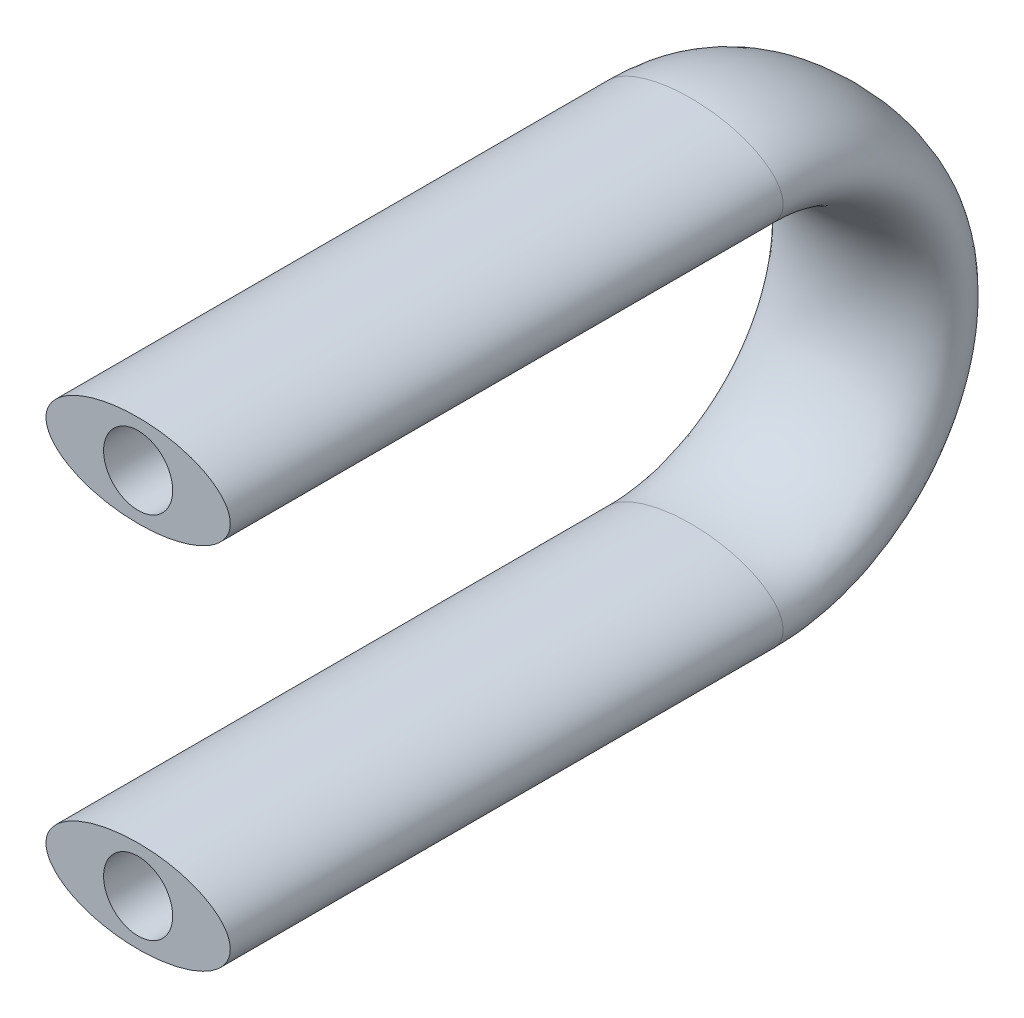
ISO-10303-21;
HEADER;
FILE_DESCRIPTION(('STEP AP214'),'2;1');
FILE_NAME('part.step','',(''),(''),'','','');
FILE_SCHEMA(('AUTOMOTIVE_DESIGN { 1 0 10303 214 1 1 1 1 }'));
ENDSEC;
DATA;
#1=APPLICATION_CONTEXT('core data for automotive mechanical design processes');
#2=APPLICATION_PROTOCOL_DEFINITION('international standard','automotive_design',2000,#1);
#3=PRODUCT_CONTEXT('',#1,'mechanical');
#4=PRODUCT('Part','Part','',(#3));
#5=PRODUCT_RELATED_PRODUCT_CATEGORY('part','',(#4));
#6=PRODUCT_DEFINITION_FORMATION('','',#4);
#7=PRODUCT_DEFINITION_CONTEXT('part definition',#1,'design');
#8=PRODUCT_DEFINITION('design','',#6,#7);
#9=PRODUCT_DEFINITION_SHAPE('','',#8);
#10=(LENGTH_UNIT() NAMED_UNIT(*) SI_UNIT(.MILLI.,.METRE.));
#11=(NAMED_UNIT(*) PLANE_ANGLE_UNIT() SI_UNIT($,.RADIAN.));
#12=(NAMED_UNIT(*) SI_UNIT($,.STERADIAN.) SOLID_ANGLE_UNIT());
#13=UNCERTAINTY_MEASURE_WITH_UNIT(LENGTH_MEASURE(1.E-05),#10,'distance_accuracy_value','');
#14=(GEOMETRIC_REPRESENTATION_CONTEXT(3) GLOBAL_UNCERTAINTY_ASSIGNED_CONTEXT((#13)) GLOBAL_UNIT_ASSIGNED_CONTEXT((#10,
#11,#12)) REPRESENTATION_CONTEXT('',''));
#15=CARTESIAN_POINT('',(0.,0.,0.));
#16=DIRECTION('',(0.,0.,1.));
#17=DIRECTION('',(1.,0.,0.));
#18=AXIS2_PLACEMENT_3D('',#15,#16,#17);
#19=CARTESIAN_POINT('',(-50.8,203.2,0.));
#20=CARTESIAN_POINT('',(-50.8,203.2,-304.8));
#21=CARTESIAN_POINT('',(-50.8,254.,0.));
#22=CARTESIAN_POINT('',(-50.8,254.,-304.8));
#23=CARTESIAN_POINT('',(50.8,254.,0.));
#24=CARTESIAN_POINT('',(50.8,254.,-304.8));
#25=CARTESIAN_POINT('',(50.8,203.2,0.));
#26=CARTESIAN_POINT('',(50.8,203.2,-304.8));
#27=CARTESIAN_POINT('',(50.8,152.4,0.));
#28=CARTESIAN_POINT('',(50.8,152.4,-304.8));
#29=CARTESIAN_POINT('',(-50.8,152.4,0.));
#30=CARTESIAN_POINT('',(-50.8,152.4,-304.8));
#31=CARTESIAN_POINT('',(-50.8,203.2,0.));
#32=CARTESIAN_POINT('',(-50.8,203.2,-304.8));
#33=(BOUNDED_SURFACE() B_SPLINE_SURFACE(3,1,((#19,#20),(#21,#22),(#23,#24),(#25,#26),(#27,#28),
(#29,#30),(#31,#32)),.UNSPECIFIED.,.T.,.F.,.F.) B_SPLINE_SURFACE_WITH_KNOTS((4,3,4),(2,2),(0.,
0.5,1.),(0.,1.),.UNSPECIFIED.) GEOMETRIC_REPRESENTATION_ITEM() RATIONAL_B_SPLINE_SURFACE(((1.,
1.),(0.333333333333333,0.333333333333333),(0.333333333333333,0.333333333333333),(1.,1.),
(0.333333333333333,0.333333333333333),(0.333333333333333,0.333333333333333),(1.,1.))) REPRESENTATION_ITEM('') SURFACE());
#34=CARTESIAN_POINT('',(0.,203.2,-304.8));
#35=DIRECTION('',(0.,0.,-1.));
#36=DIRECTION('',(-1.,0.,0.));
#37=AXIS2_PLACEMENT_3D('',#34,#35,#36);
#38=ELLIPSE('',#37,50.8,25.4);
#39=CARTESIAN_POINT('',(-50.8,203.2,-304.8));
#40=VERTEX_POINT('',#39);
#41=EDGE_CURVE('E67',#40,#40,#38,.T.);
#42=CARTESIAN_POINT('',(0.,203.2,0.));
#43=DIRECTION('',(0.,0.,-1.));
#44=DIRECTION('',(-1.,0.,0.));
#45=AXIS2_PLACEMENT_3D('',#42,#43,#44);
#46=ELLIPSE('',#45,50.8,25.4);
#47=CARTESIAN_POINT('',(-50.8,203.2,0.));
#48=VERTEX_POINT('',#47);
#49=EDGE_CURVE('E64',#48,#48,#46,.T.);
#50=ORIENTED_EDGE('',*,*,#41,.F.);
#51=EDGE_LOOP('',(#50));
#52=FACE_BOUND('',#51,.T.);
#53=ORIENTED_EDGE('',*,*,#49,.T.);
#54=EDGE_LOOP('',(#53));
#55=FACE_BOUND('',#54,.T.);
#56=ADVANCED_FACE('F37',(#52,#55),#33,.T.);
#57=CARTESIAN_POINT('',(-50.8,203.2,-304.8));
#58=CARTESIAN_POINT('',(-50.8,203.2,-508.));
#59=CARTESIAN_POINT('',(-50.8,0.,-508.));
#60=CARTESIAN_POINT('',(-50.8,0.,-304.8));
#61=CARTESIAN_POINT('',(-50.8,254.,-304.8));
#62=CARTESIAN_POINT('',(-50.8,254.,-609.6));
#63=CARTESIAN_POINT('',(-50.8,-50.8,-609.6));
#64=CARTESIAN_POINT('',(-50.8,-50.8,-304.8));
#65=CARTESIAN_POINT('',(50.8,254.,-304.8));
#66=CARTESIAN_POINT('',(50.8,254.,-609.6));
#67=CARTESIAN_POINT('',(50.8,-50.8,-609.6));
#68=CARTESIAN_POINT('',(50.8,-50.8,-304.8));
#69=CARTESIAN_POINT('',(50.8,203.2,-304.8));
#70=CARTESIAN_POINT('',(50.8,203.2,-508.));
#71=CARTESIAN_POINT('',(50.8,0.,-508.));
#72=CARTESIAN_POINT('',(50.8,0.,-304.8));
#73=CARTESIAN_POINT('',(50.8,152.4,-304.8));
#74=CARTESIAN_POINT('',(50.8,152.4,-406.4));
#75=CARTESIAN_POINT('',(50.8,50.8,-406.4));
#76=CARTESIAN_POINT('',(50.8,50.8,-304.8));
#77=CARTESIAN_POINT('',(-50.8,152.4,-304.8));
#78=CARTESIAN_POINT('',(-50.8,152.4,-406.4));
#79=CARTESIAN_POINT('',(-50.8,50.8,-406.4));
#80=CARTESIAN_POINT('',(-50.8,50.8,-304.8));
#81=CARTESIAN_POINT('',(-50.8,203.2,-304.8));
#82=CARTESIAN_POINT('',(-50.8,203.2,-508.));
#83=CARTESIAN_POINT('',(-50.8,0.,-508.));
#84=CARTESIAN_POINT('',(-50.8,0.,-304.8));
#85=(BOUNDED_SURFACE() B_SPLINE_SURFACE(3,3,((#57,#58,#59,#60),(#61,#62,#63,#64),(#65,#66,#67,
#68),(#69,#70,#71,#72),(#73,#74,#75,#76),(#77,#78,#79,#80),(#81,#82,#83,#84)),.UNSPECIFIED.,.T.,
.F.,.F.) B_SPLINE_SURFACE_WITH_KNOTS((4,3,4),(4,4),(0.,0.5,1.),(0.,1.),
.UNSPECIFIED.) GEOMETRIC_REPRESENTATION_ITEM() RATIONAL_B_SPLINE_SURFACE(((1.,0.333333333333333,
0.333333333333333,1.),(0.333333333333333,0.111111111111111,0.111111111111111,0.333333333333333),
(0.333333333333333,0.111111111111111,0.111111111111111,0.333333333333333),(1.,0.333333333333333,
0.333333333333333,1.),(0.333333333333333,0.111111111111111,0.111111111111111,0.333333333333333),
(0.333333333333333,0.111111111111111,0.111111111111111,0.333333333333333),(1.,0.333333333333333,
0.333333333333333,1.))) REPRESENTATION_ITEM('') SURFACE());
#86=CARTESIAN_POINT('',(0.,0.,-304.8));
#87=DIRECTION('',(0.,0.,1.));
#88=DIRECTION('',(-1.,0.,0.));
#89=AXIS2_PLACEMENT_3D('',#86,#87,#88);
#90=ELLIPSE('',#89,50.8,25.4);
#91=CARTESIAN_POINT('',(-50.8,0.,-304.8));
#92=VERTEX_POINT('',#91);
#93=EDGE_CURVE('E43',#92,#92,#90,.T.);
#94=ORIENTED_EDGE('',*,*,#93,.F.);
#95=EDGE_LOOP('',(#94));
#96=FACE_BOUND('',#95,.T.);
#97=ORIENTED_EDGE('',*,*,#41,.T.);
#98=EDGE_LOOP('',(#97));
#99=FACE_BOUND('',#98,.T.);
#100=ADVANCED_FACE('F79',(#96,#99),#85,.T.);
#101=CARTESIAN_POINT('',(-50.8,0.,-304.8));
#102=CARTESIAN_POINT('',(-50.8,0.,0.));
#103=CARTESIAN_POINT('',(-50.8,-50.8,-304.8));
#104=CARTESIAN_POINT('',(-50.8,-50.8,0.));
#105=CARTESIAN_POINT('',(50.8,-50.8,-304.8));
#106=CARTESIAN_POINT('',(50.8,-50.8,0.));
#107=CARTESIAN_POINT('',(50.8,0.,-304.8));
#108=CARTESIAN_POINT('',(50.8,0.,0.));
#109=CARTESIAN_POINT('',(50.8,50.8,-304.8));
#110=CARTESIAN_POINT('',(50.8,50.8,0.));
#111=CARTESIAN_POINT('',(-50.8,50.8,-304.8));
#112=CARTESIAN_POINT('',(-50.8,50.8,0.));
#113=CARTESIAN_POINT('',(-50.8,0.,-304.8));
#114=CARTESIAN_POINT('',(-50.8,0.,0.));
#115=(BOUNDED_SURFACE() B_SPLINE_SURFACE(3,1,((#101,#102),(#103,#104),(#105,#106),(#107,#108),
(#109,#110),(#111,#112),(#113,#114)),.UNSPECIFIED.,.T.,.F.,.F.) B_SPLINE_SURFACE_WITH_KNOTS((4,
3,4),(2,2),(0.,0.5,1.),(0.,1.),
.UNSPECIFIED.) GEOMETRIC_REPRESENTATION_ITEM() RATIONAL_B_SPLINE_SURFACE(((1.,1.),
(0.333333333333333,0.333333333333333),(0.333333333333333,0.333333333333333),(1.,1.),
(0.333333333333333,0.333333333333333),(0.333333333333333,0.333333333333333),(1.,1.))) REPRESENTATION_ITEM('') SURFACE());
#116=CARTESIAN_POINT('',(0.,0.,0.));
#117=DIRECTION('',(0.,0.,1.));
#118=DIRECTION('',(-1.,0.,0.));
#119=AXIS2_PLACEMENT_3D('',#116,#117,#118);
#120=ELLIPSE('',#119,50.8,25.4);
#121=CARTESIAN_POINT('',(-50.8,0.,0.));
#122=VERTEX_POINT('',#121);
#123=EDGE_CURVE('E59',#122,#122,#120,.T.);
#124=ORIENTED_EDGE('',*,*,#123,.F.);
#125=EDGE_LOOP('',(#124));
#126=FACE_BOUND('',#125,.T.);
#127=ORIENTED_EDGE('',*,*,#93,.T.);
#128=EDGE_LOOP('',(#127));
#129=FACE_BOUND('',#128,.T.);
#130=ADVANCED_FACE('F39',(#126,#129),#115,.T.);
#131=CARTESIAN_POINT('',(0.,203.2,0.));
#132=DIRECTION('',(0.,0.,-1.));
#133=DIRECTION('',(1.,0.,0.));
#134=AXIS2_PLACEMENT_3D('',#131,#132,#133);
#135=PLANE('',#134);
#136=CARTESIAN_POINT('',(0.,203.2,0.));
#137=DIRECTION('',(0.,0.,-1.));
#138=DIRECTION('',(1.,0.,0.));
#139=AXIS2_PLACEMENT_3D('',#136,#137,#138);
#140=CIRCLE('',#139,19.05);
#141=CARTESIAN_POINT('',(19.05,203.2,0.));
#142=VERTEX_POINT('',#141);
#143=EDGE_CURVE('E63',#142,#142,#140,.F.);
#144=ORIENTED_EDGE('',*,*,#143,.F.);
#145=EDGE_LOOP('',(#144));
#146=FACE_BOUND('',#145,.T.);
#147=ORIENTED_EDGE('',*,*,#49,.F.);
#148=EDGE_LOOP('',(#147));
#149=FACE_BOUND('',#148,.T.);
#150=ADVANCED_FACE('F85',(#146,#149),#135,.F.);
#151=CARTESIAN_POINT('',(0.,0.,0.));
#152=DIRECTION('',(0.,0.,1.));
#153=DIRECTION('',(1.,0.,0.));
#154=AXIS2_PLACEMENT_3D('',#151,#152,#153);
#155=PLANE('',#154);
#156=CARTESIAN_POINT('',(0.,0.,0.));
#157=DIRECTION('',(0.,0.,1.));
#158=DIRECTION('',(1.,0.,0.));
#159=AXIS2_PLACEMENT_3D('',#156,#157,#158);
#160=CIRCLE('',#159,19.05);
#161=CARTESIAN_POINT('',(19.05,0.,0.));
#162=VERTEX_POINT('',#161);
#163=EDGE_CURVE('E10',#162,#162,#160,.F.);
#164=ORIENTED_EDGE('',*,*,#163,.T.);
#165=EDGE_LOOP('',(#164));
#166=FACE_BOUND('',#165,.T.);
#167=ORIENTED_EDGE('',*,*,#123,.T.);
#168=EDGE_LOOP('',(#167));
#169=FACE_BOUND('',#168,.T.);
#170=ADVANCED_FACE('F105',(#166,#169),#155,.T.);
#171=CARTESIAN_POINT('',(0.,203.2,0.));
#172=DIRECTION('',(0.,0.,-1.));
#173=DIRECTION('',(-1.,0.,0.));
#174=AXIS2_PLACEMENT_3D('',#171,#172,#173);
#175=CYLINDRICAL_SURFACE('',#174,19.05);
#176=CARTESIAN_POINT('',(0.,203.2,-304.8));
#177=DIRECTION('',(0.,0.,-1.));
#178=DIRECTION('',(1.,0.,0.));
#179=AXIS2_PLACEMENT_3D('',#176,#177,#178);
#180=CIRCLE('',#179,19.05);
#181=CARTESIAN_POINT('',(0.,222.25,-304.8));
#182=VERTEX_POINT('',#181);
#183=EDGE_CURVE('E55',#182,#182,#180,.F.);
#184=ORIENTED_EDGE('',*,*,#183,.F.);
#185=EDGE_LOOP('',(#184));
#186=FACE_BOUND('',#185,.T.);
#187=ORIENTED_EDGE('',*,*,#143,.T.);
#188=EDGE_LOOP('',(#187));
#189=FACE_BOUND('',#188,.T.);
#190=ADVANCED_FACE('F99',(#186,#189),#175,.F.);
#191=CARTESIAN_POINT('',(0.,101.6,-304.8));
#192=DIRECTION('',(-1.,0.,0.));
#193=DIRECTION('',(0.,0.,1.));
#194=AXIS2_PLACEMENT_3D('',#191,#192,#193);
#195=TOROIDAL_SURFACE('',#194,101.6,19.05);
#196=CARTESIAN_POINT('',(0.,0.,-304.8));
#197=DIRECTION('',(0.,0.,1.));
#198=DIRECTION('',(1.,0.,0.));
#199=AXIS2_PLACEMENT_3D('',#196,#197,#198);
#200=CIRCLE('',#199,19.05);
#201=CARTESIAN_POINT('',(0.,-19.05,-304.8));
#202=VERTEX_POINT('',#201);
#203=EDGE_CURVE('E48',#202,#202,#200,.F.);
#204=CARTESIAN_POINT('',(0.,101.6,-304.8));
#205=DIRECTION('',(-1.,0.,0.));
#206=DIRECTION('',(0.,0.,1.));
#207=AXIS2_PLACEMENT_3D('',#204,#205,#206);
#208=CIRCLE('',#207,120.65);
#209=EDGE_CURVE('',#182,#202,#208,.T.);
#210=ORIENTED_EDGE('',*,*,#183,.T.);
#211=ORIENTED_EDGE('',*,*,#203,.F.);
#212=ORIENTED_EDGE('',*,*,#209,.T.);
#213=ORIENTED_EDGE('',*,*,#209,.F.);
#214=EDGE_LOOP('',(#210,#212,#211,#213));
#215=FACE_BOUND('',#214,.T.);
#216=ADVANCED_FACE('F93',(#215),#195,.F.);
#217=CARTESIAN_POINT('',(0.,0.,-304.8));
#218=DIRECTION('',(0.,0.,1.));
#219=DIRECTION('',(1.,0.,0.));
#220=AXIS2_PLACEMENT_3D('',#217,#218,#219);
#221=CYLINDRICAL_SURFACE('',#220,19.05);
#222=ORIENTED_EDGE('',*,*,#163,.F.);
#223=EDGE_LOOP('',(#222));
#224=FACE_BOUND('',#223,.T.);
#225=ORIENTED_EDGE('',*,*,#203,.T.);
#226=EDGE_LOOP('',(#225));
#227=FACE_BOUND('',#226,.T.);
#228=ADVANCED_FACE('F91',(#224,#227),#221,.F.);
#229=CLOSED_SHELL('',(#56,#100,#130,#150,#170,#190,#216,#228));
#230=MANIFOLD_SOLID_BREP('B2',#229);
#231=ADVANCED_BREP_SHAPE_REPRESENTATION('',(#18,#230),#14);
#232=SHAPE_DEFINITION_REPRESENTATION(#9,#231);
ENDSEC;
END-ISO-10303-21;
